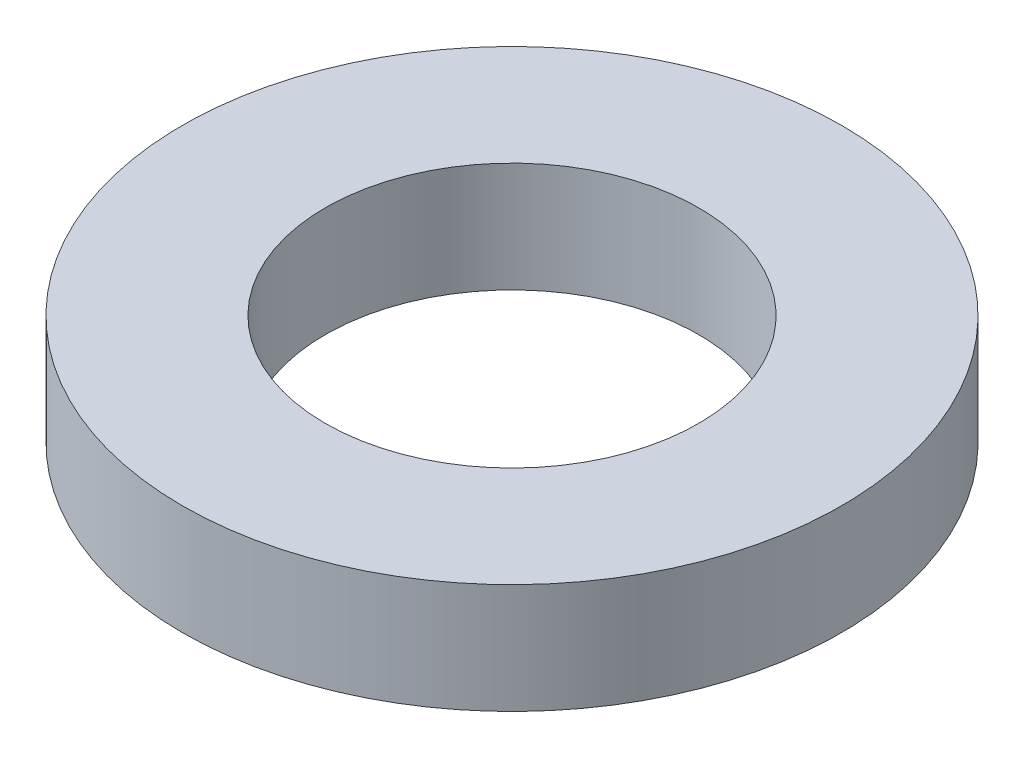
ISO-10303-21;
HEADER;
FILE_DESCRIPTION(('STEP AP214'),'2;1');
FILE_NAME('part.step','',(''),(''),'','','');
FILE_SCHEMA(('AUTOMOTIVE_DESIGN { 1 0 10303 214 1 1 1 1 }'));
ENDSEC;
DATA;
#1=APPLICATION_CONTEXT('core data for automotive mechanical design processes');
#2=APPLICATION_PROTOCOL_DEFINITION('international standard','automotive_design',2000,#1);
#3=PRODUCT_CONTEXT('',#1,'mechanical');
#4=PRODUCT('Part','Part','',(#3));
#5=PRODUCT_RELATED_PRODUCT_CATEGORY('part','',(#4));
#6=PRODUCT_DEFINITION_FORMATION('','',#4);
#7=PRODUCT_DEFINITION_CONTEXT('part definition',#1,'design');
#8=PRODUCT_DEFINITION('design','',#6,#7);
#9=PRODUCT_DEFINITION_SHAPE('','',#8);
#10=(LENGTH_UNIT() NAMED_UNIT(*) SI_UNIT(.MILLI.,.METRE.));
#11=(NAMED_UNIT(*) PLANE_ANGLE_UNIT() SI_UNIT($,.RADIAN.));
#12=(NAMED_UNIT(*) SI_UNIT($,.STERADIAN.) SOLID_ANGLE_UNIT());
#13=UNCERTAINTY_MEASURE_WITH_UNIT(LENGTH_MEASURE(1.E-05),#10,'distance_accuracy_value','');
#14=(GEOMETRIC_REPRESENTATION_CONTEXT(3) GLOBAL_UNCERTAINTY_ASSIGNED_CONTEXT((#13)) GLOBAL_UNIT_ASSIGNED_CONTEXT((#10,
#11,#12)) REPRESENTATION_CONTEXT('',''));
#15=CARTESIAN_POINT('',(0.,0.,0.));
#16=DIRECTION('',(0.,0.,1.));
#17=DIRECTION('',(1.,0.,0.));
#18=AXIS2_PLACEMENT_3D('',#15,#16,#17);
#19=CARTESIAN_POINT('',(0.,1.5,0.));
#20=DIRECTION('',(0.,1.,0.));
#21=DIRECTION('',(0.,0.,1.));
#22=AXIS2_PLACEMENT_3D('',#19,#20,#21);
#23=PLANE('',#22);
#24=CARTESIAN_POINT('',(0.,1.5,0.));
#25=DIRECTION('',(0.,1.,0.));
#26=DIRECTION('',(0.,0.,1.));
#27=AXIS2_PLACEMENT_3D('',#24,#25,#26);
#28=CIRCLE('',#27,4.5);
#29=CARTESIAN_POINT('',(0.,1.5,4.5));
#30=VERTEX_POINT('',#29);
#31=EDGE_CURVE('E10',#30,#30,#28,.T.);
#32=ORIENTED_EDGE('',*,*,#31,.T.);
#33=EDGE_LOOP('',(#32));
#34=FACE_BOUND('',#33,.T.);
#35=CARTESIAN_POINT('',(0.,1.5,0.));
#36=DIRECTION('',(0.,1.,0.));
#37=DIRECTION('',(0.,0.,1.));
#38=AXIS2_PLACEMENT_3D('',#35,#36,#37);
#39=CIRCLE('',#38,2.55);
#40=CARTESIAN_POINT('',(0.,1.5,2.55));
#41=VERTEX_POINT('',#40);
#42=EDGE_CURVE('E50',#41,#41,#39,.T.);
#43=ORIENTED_EDGE('',*,*,#42,.F.);
#44=EDGE_LOOP('',(#43));
#45=FACE_BOUND('',#44,.T.);
#46=ADVANCED_FACE('F39',(#34,#45),#23,.T.);
#47=CARTESIAN_POINT('',(0.,0.,0.));
#48=DIRECTION('',(0.,1.,0.));
#49=DIRECTION('',(0.,0.,1.));
#50=AXIS2_PLACEMENT_3D('',#47,#48,#49);
#51=PLANE('',#50);
#52=CARTESIAN_POINT('',(0.,0.,0.));
#53=DIRECTION('',(0.,1.,0.));
#54=DIRECTION('',(0.,0.,1.));
#55=AXIS2_PLACEMENT_3D('',#52,#53,#54);
#56=CIRCLE('',#55,4.5);
#57=CARTESIAN_POINT('',(0.,0.,4.5));
#58=VERTEX_POINT('',#57);
#59=EDGE_CURVE('E43',#58,#58,#56,.T.);
#60=ORIENTED_EDGE('',*,*,#59,.F.);
#61=EDGE_LOOP('',(#60));
#62=FACE_BOUND('',#61,.T.);
#63=CARTESIAN_POINT('',(0.,0.,0.));
#64=DIRECTION('',(0.,1.,0.));
#65=DIRECTION('',(0.,0.,1.));
#66=AXIS2_PLACEMENT_3D('',#63,#64,#65);
#67=CIRCLE('',#66,2.55);
#68=CARTESIAN_POINT('',(0.,0.,2.55));
#69=VERTEX_POINT('',#68);
#70=EDGE_CURVE('E52',#69,#69,#67,.T.);
#71=ORIENTED_EDGE('',*,*,#70,.T.);
#72=EDGE_LOOP('',(#71));
#73=FACE_BOUND('',#72,.T.);
#74=ADVANCED_FACE('F62',(#62,#73),#51,.F.);
#75=CARTESIAN_POINT('',(0.,1.5,0.));
#76=DIRECTION('',(0.,-1.,0.));
#77=DIRECTION('',(0.,0.,-1.));
#78=AXIS2_PLACEMENT_3D('',#75,#76,#77);
#79=CYLINDRICAL_SURFACE('',#78,4.5);
#80=ORIENTED_EDGE('',*,*,#31,.F.);
#81=EDGE_LOOP('',(#80));
#82=FACE_BOUND('',#81,.T.);
#83=ORIENTED_EDGE('',*,*,#59,.T.);
#84=EDGE_LOOP('',(#83));
#85=FACE_BOUND('',#84,.T.);
#86=ADVANCED_FACE('F41',(#82,#85),#79,.T.);
#87=CARTESIAN_POINT('',(0.,1.5,0.));
#88=DIRECTION('',(0.,-1.,0.));
#89=DIRECTION('',(0.,0.,-1.));
#90=AXIS2_PLACEMENT_3D('',#87,#88,#89);
#91=CYLINDRICAL_SURFACE('',#90,2.55);
#92=ORIENTED_EDGE('',*,*,#42,.T.);
#93=EDGE_LOOP('',(#92));
#94=FACE_BOUND('',#93,.T.);
#95=ORIENTED_EDGE('',*,*,#70,.F.);
#96=EDGE_LOOP('',(#95));
#97=FACE_BOUND('',#96,.T.);
#98=ADVANCED_FACE('F58',(#94,#97),#91,.F.);
#99=CLOSED_SHELL('',(#46,#74,#86,#98));
#100=MANIFOLD_SOLID_BREP('B2',#99);
#101=ADVANCED_BREP_SHAPE_REPRESENTATION('',(#18,#100),#14);
#102=SHAPE_DEFINITION_REPRESENTATION(#9,#101);
ENDSEC;
END-ISO-10303-21;
